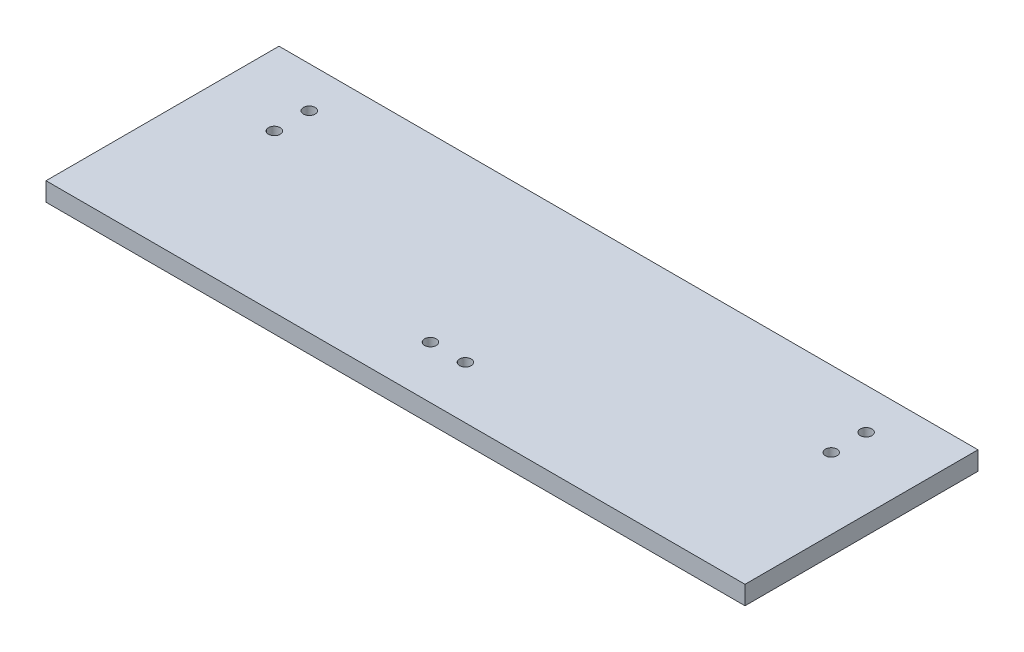
ISO-10303-21;
HEADER;
FILE_DESCRIPTION(('STEP AP214'),'2;1');
FILE_NAME('part.step','',(''),(''),'','','');
FILE_SCHEMA(('AUTOMOTIVE_DESIGN { 1 0 10303 214 1 1 1 1 }'));
ENDSEC;
DATA;
#1=APPLICATION_CONTEXT('core data for automotive mechanical design processes');
#2=APPLICATION_PROTOCOL_DEFINITION('international standard','automotive_design',2000,#1);
#3=PRODUCT_CONTEXT('',#1,'mechanical');
#4=PRODUCT('Part','Part','',(#3));
#5=PRODUCT_RELATED_PRODUCT_CATEGORY('part','',(#4));
#6=PRODUCT_DEFINITION_FORMATION('','',#4);
#7=PRODUCT_DEFINITION_CONTEXT('part definition',#1,'design');
#8=PRODUCT_DEFINITION('design','',#6,#7);
#9=PRODUCT_DEFINITION_SHAPE('','',#8);
#10=(LENGTH_UNIT() NAMED_UNIT(*) SI_UNIT(.MILLI.,.METRE.));
#11=(NAMED_UNIT(*) PLANE_ANGLE_UNIT() SI_UNIT($,.RADIAN.));
#12=(NAMED_UNIT(*) SI_UNIT($,.STERADIAN.) SOLID_ANGLE_UNIT());
#13=UNCERTAINTY_MEASURE_WITH_UNIT(LENGTH_MEASURE(1.E-05),#10,'distance_accuracy_value','');
#14=(GEOMETRIC_REPRESENTATION_CONTEXT(3) GLOBAL_UNCERTAINTY_ASSIGNED_CONTEXT((#13)) GLOBAL_UNIT_ASSIGNED_CONTEXT((#10,
#11,#12)) REPRESENTATION_CONTEXT('',''));
#15=CARTESIAN_POINT('',(0.,0.,0.));
#16=DIRECTION('',(0.,0.,1.));
#17=DIRECTION('',(1.,0.,0.));
#18=AXIS2_PLACEMENT_3D('',#15,#16,#17);
#19=CARTESIAN_POINT('',(-150.,8.,-50.));
#20=DIRECTION('',(1.,0.,0.));
#21=DIRECTION('',(0.,0.,-1.));
#22=AXIS2_PLACEMENT_3D('',#19,#20,#21);
#23=PLANE('',#22);
#24=DIRECTION('',(0.,0.,1.));
#25=VECTOR('',#24,1.);
#26=CARTESIAN_POINT('',(-150.,0.,-50.));
#27=LINE('',#26,#25);
#28=CARTESIAN_POINT('',(-150.,0.,-50.));
#29=VERTEX_POINT('',#28);
#30=CARTESIAN_POINT('',(-150.,0.,50.));
#31=VERTEX_POINT('',#30);
#32=EDGE_CURVE('E99',#29,#31,#27,.T.);
#33=ORIENTED_EDGE('',*,*,#32,.T.);
#34=DIRECTION('',(0.,-1.,0.));
#35=VECTOR('',#34,1.);
#36=CARTESIAN_POINT('',(-150.,8.,50.));
#37=LINE('',#36,#35);
#38=CARTESIAN_POINT('',(-150.,8.,50.));
#39=VERTEX_POINT('',#38);
#40=EDGE_CURVE('E11',#39,#31,#37,.T.);
#41=ORIENTED_EDGE('',*,*,#40,.F.);
#42=DIRECTION('',(0.,0.,1.));
#43=VECTOR('',#42,1.);
#44=CARTESIAN_POINT('',(-150.,8.,-50.));
#45=LINE('',#44,#43);
#46=CARTESIAN_POINT('',(-150.,8.,-50.));
#47=VERTEX_POINT('',#46);
#48=EDGE_CURVE('E87',#47,#39,#45,.T.);
#49=ORIENTED_EDGE('',*,*,#48,.F.);
#50=DIRECTION('',(0.,-1.,0.));
#51=VECTOR('',#50,1.);
#52=CARTESIAN_POINT('',(-150.,8.,-50.));
#53=LINE('',#52,#51);
#54=EDGE_CURVE('E95',#47,#29,#53,.T.);
#55=ORIENTED_EDGE('',*,*,#54,.T.);
#56=EDGE_LOOP('',(#33,#41,#49,#55));
#57=FACE_BOUND('',#56,.T.);
#58=ADVANCED_FACE('F36',(#57),#23,.F.);
#59=CARTESIAN_POINT('',(150.,8.,50.));
#60=DIRECTION('',(0.,0.,-1.));
#61=DIRECTION('',(-1.,0.,0.));
#62=AXIS2_PLACEMENT_3D('',#59,#60,#61);
#63=PLANE('',#62);
#64=DIRECTION('',(1.,0.,0.));
#65=VECTOR('',#64,1.);
#66=CARTESIAN_POINT('',(150.,0.,50.));
#67=LINE('',#66,#65);
#68=CARTESIAN_POINT('',(150.,0.,50.));
#69=VERTEX_POINT('',#68);
#70=EDGE_CURVE('E91',#31,#69,#67,.T.);
#71=ORIENTED_EDGE('',*,*,#70,.T.);
#72=DIRECTION('',(0.,-1.,0.));
#73=VECTOR('',#72,1.);
#74=CARTESIAN_POINT('',(150.,8.,50.));
#75=LINE('',#74,#73);
#76=CARTESIAN_POINT('',(150.,8.,50.));
#77=VERTEX_POINT('',#76);
#78=EDGE_CURVE('E44',#77,#69,#75,.T.);
#79=ORIENTED_EDGE('',*,*,#78,.F.);
#80=DIRECTION('',(1.,0.,0.));
#81=VECTOR('',#80,1.);
#82=CARTESIAN_POINT('',(150.,8.,50.));
#83=LINE('',#82,#81);
#84=EDGE_CURVE('E82',#39,#77,#83,.T.);
#85=ORIENTED_EDGE('',*,*,#84,.F.);
#86=ORIENTED_EDGE('',*,*,#40,.T.);
#87=EDGE_LOOP('',(#71,#79,#85,#86));
#88=FACE_BOUND('',#87,.T.);
#89=ADVANCED_FACE('F90',(#88),#63,.F.);
#90=CARTESIAN_POINT('',(150.,8.,-50.));
#91=DIRECTION('',(-1.,0.,0.));
#92=DIRECTION('',(0.,0.,1.));
#93=AXIS2_PLACEMENT_3D('',#90,#91,#92);
#94=PLANE('',#93);
#95=DIRECTION('',(0.,0.,-1.));
#96=VECTOR('',#95,1.);
#97=CARTESIAN_POINT('',(150.,0.,-50.));
#98=LINE('',#97,#96);
#99=CARTESIAN_POINT('',(150.,0.,-50.));
#100=VERTEX_POINT('',#99);
#101=EDGE_CURVE('E69',#69,#100,#98,.T.);
#102=ORIENTED_EDGE('',*,*,#101,.T.);
#103=DIRECTION('',(0.,-1.,0.));
#104=VECTOR('',#103,1.);
#105=CARTESIAN_POINT('',(150.,8.,-50.));
#106=LINE('',#105,#104);
#107=CARTESIAN_POINT('',(150.,8.,-50.));
#108=VERTEX_POINT('',#107);
#109=EDGE_CURVE('E92',#108,#100,#106,.T.);
#110=ORIENTED_EDGE('',*,*,#109,.F.);
#111=DIRECTION('',(0.,0.,-1.));
#112=VECTOR('',#111,1.);
#113=CARTESIAN_POINT('',(150.,8.,-50.));
#114=LINE('',#113,#112);
#115=EDGE_CURVE('E85',#77,#108,#114,.T.);
#116=ORIENTED_EDGE('',*,*,#115,.F.);
#117=ORIENTED_EDGE('',*,*,#78,.T.);
#118=EDGE_LOOP('',(#102,#110,#116,#117));
#119=FACE_BOUND('',#118,.T.);
#120=ADVANCED_FACE('F93',(#119),#94,.F.);
#121=CARTESIAN_POINT('',(150.,8.,-50.));
#122=DIRECTION('',(0.,0.,1.));
#123=DIRECTION('',(1.,0.,0.));
#124=AXIS2_PLACEMENT_3D('',#121,#122,#123);
#125=PLANE('',#124);
#126=DIRECTION('',(-1.,0.,0.));
#127=VECTOR('',#126,1.);
#128=CARTESIAN_POINT('',(150.,0.,-50.));
#129=LINE('',#128,#127);
#130=EDGE_CURVE('E75',#100,#29,#129,.T.);
#131=ORIENTED_EDGE('',*,*,#130,.T.);
#132=ORIENTED_EDGE('',*,*,#54,.F.);
#133=DIRECTION('',(-1.,0.,0.));
#134=VECTOR('',#133,1.);
#135=CARTESIAN_POINT('',(150.,8.,-50.));
#136=LINE('',#135,#134);
#137=EDGE_CURVE('E52',#108,#47,#136,.T.);
#138=ORIENTED_EDGE('',*,*,#137,.F.);
#139=ORIENTED_EDGE('',*,*,#109,.T.);
#140=EDGE_LOOP('',(#131,#132,#138,#139));
#141=FACE_BOUND('',#140,.T.);
#142=ADVANCED_FACE('F107',(#141),#125,.F.);
#143=CARTESIAN_POINT('',(0.,8.,0.));
#144=DIRECTION('',(0.,-1.,0.));
#145=DIRECTION('',(0.,0.,-1.));
#146=AXIS2_PLACEMENT_3D('',#143,#144,#145);
#147=PLANE('',#146);
#148=CARTESIAN_POINT('',(119.5,7.99999999999999,-17.5));
#149=DIRECTION('',(0.,-1.,0.));
#150=DIRECTION('',(0.,0.,1.));
#151=AXIS2_PLACEMENT_3D('',#148,#149,#150);
#152=CIRCLE('',#151,2.5);
#153=CARTESIAN_POINT('',(119.5,7.99999999999999,-15.));
#154=VERTEX_POINT('',#153);
#155=EDGE_CURVE('E143',#154,#154,#152,.T.);
#156=ORIENTED_EDGE('',*,*,#155,.T.);
#157=EDGE_LOOP('',(#156));
#158=FACE_BOUND('',#157,.T.);
#159=CARTESIAN_POINT('',(119.5,7.99999999999999,-32.5));
#160=DIRECTION('',(0.,-1.,0.));
#161=DIRECTION('',(0.,0.,1.));
#162=AXIS2_PLACEMENT_3D('',#159,#160,#161);
#163=CIRCLE('',#162,2.5);
#164=CARTESIAN_POINT('',(119.5,7.99999999999999,-30.));
#165=VERTEX_POINT('',#164);
#166=EDGE_CURVE('E137',#165,#165,#163,.T.);
#167=ORIENTED_EDGE('',*,*,#166,.T.);
#168=EDGE_LOOP('',(#167));
#169=FACE_BOUND('',#168,.T.);
#170=CARTESIAN_POINT('',(-119.5,7.99999999999999,-17.5));
#171=DIRECTION('',(0.,1.,0.));
#172=DIRECTION('',(0.,0.,1.));
#173=AXIS2_PLACEMENT_3D('',#170,#171,#172);
#174=CIRCLE('',#173,2.5);
#175=CARTESIAN_POINT('',(-119.5,7.99999999999999,-15.));
#176=VERTEX_POINT('',#175);
#177=EDGE_CURVE('E131',#176,#176,#174,.T.);
#178=ORIENTED_EDGE('',*,*,#177,.F.);
#179=EDGE_LOOP('',(#178));
#180=FACE_BOUND('',#179,.T.);
#181=CARTESIAN_POINT('',(-119.5,7.99999999999999,-32.5));
#182=DIRECTION('',(0.,1.,0.));
#183=DIRECTION('',(0.,0.,1.));
#184=AXIS2_PLACEMENT_3D('',#181,#182,#183);
#185=CIRCLE('',#184,2.5);
#186=CARTESIAN_POINT('',(-119.5,7.99999999999999,-30.));
#187=VERTEX_POINT('',#186);
#188=EDGE_CURVE('E125',#187,#187,#185,.T.);
#189=ORIENTED_EDGE('',*,*,#188,.F.);
#190=EDGE_LOOP('',(#189));
#191=FACE_BOUND('',#190,.T.);
#192=CARTESIAN_POINT('',(7.50000000000083,7.99999999999999,27.5));
#193=DIRECTION('',(0.,1.,0.));
#194=DIRECTION('',(0.,0.,1.));
#195=AXIS2_PLACEMENT_3D('',#192,#193,#194);
#196=CIRCLE('',#195,2.5);
#197=CARTESIAN_POINT('',(7.50000000000083,7.99999999999999,30.));
#198=VERTEX_POINT('',#197);
#199=EDGE_CURVE('E119',#198,#198,#196,.T.);
#200=ORIENTED_EDGE('',*,*,#199,.F.);
#201=EDGE_LOOP('',(#200));
#202=FACE_BOUND('',#201,.T.);
#203=CARTESIAN_POINT('',(-7.49999999999917,7.99999999999999,27.5));
#204=DIRECTION('',(0.,1.,0.));
#205=DIRECTION('',(0.,0.,1.));
#206=AXIS2_PLACEMENT_3D('',#203,#204,#205);
#207=CIRCLE('',#206,2.50000000000001);
#208=CARTESIAN_POINT('',(-7.49999999999917,7.99999999999999,30.));
#209=VERTEX_POINT('',#208);
#210=EDGE_CURVE('E113',#209,#209,#207,.T.);
#211=ORIENTED_EDGE('',*,*,#210,.F.);
#212=EDGE_LOOP('',(#211));
#213=FACE_BOUND('',#212,.T.);
#214=ORIENTED_EDGE('',*,*,#48,.T.);
#215=ORIENTED_EDGE('',*,*,#84,.T.);
#216=ORIENTED_EDGE('',*,*,#115,.T.);
#217=ORIENTED_EDGE('',*,*,#137,.T.);
#218=EDGE_LOOP('',(#214,#215,#216,#217));
#219=FACE_BOUND('',#218,.T.);
#220=ADVANCED_FACE('F83',(#158,#169,#180,#191,#202,#213,#219),#147,.F.);
#221=CARTESIAN_POINT('',(0.,0.,0.));
#222=DIRECTION('',(0.,-1.,0.));
#223=DIRECTION('',(0.,0.,-1.));
#224=AXIS2_PLACEMENT_3D('',#221,#222,#223);
#225=PLANE('',#224);
#226=CARTESIAN_POINT('',(119.5,0.,-17.5));
#227=DIRECTION('',(0.,-1.,0.));
#228=DIRECTION('',(0.,0.,1.));
#229=AXIS2_PLACEMENT_3D('',#226,#227,#228);
#230=CIRCLE('',#229,2.5);
#231=CARTESIAN_POINT('',(119.5,0.,-15.));
#232=VERTEX_POINT('',#231);
#233=EDGE_CURVE('E140',#232,#232,#230,.T.);
#234=ORIENTED_EDGE('',*,*,#233,.F.);
#235=EDGE_LOOP('',(#234));
#236=FACE_BOUND('',#235,.T.);
#237=CARTESIAN_POINT('',(119.5,0.,-32.5));
#238=DIRECTION('',(0.,-1.,0.));
#239=DIRECTION('',(0.,0.,1.));
#240=AXIS2_PLACEMENT_3D('',#237,#238,#239);
#241=CIRCLE('',#240,2.5);
#242=CARTESIAN_POINT('',(119.5,0.,-30.));
#243=VERTEX_POINT('',#242);
#244=EDGE_CURVE('E134',#243,#243,#241,.T.);
#245=ORIENTED_EDGE('',*,*,#244,.F.);
#246=EDGE_LOOP('',(#245));
#247=FACE_BOUND('',#246,.T.);
#248=CARTESIAN_POINT('',(-119.5,0.,-17.5));
#249=DIRECTION('',(0.,1.,0.));
#250=DIRECTION('',(0.,0.,1.));
#251=AXIS2_PLACEMENT_3D('',#248,#249,#250);
#252=CIRCLE('',#251,2.5);
#253=CARTESIAN_POINT('',(-119.5,0.,-15.));
#254=VERTEX_POINT('',#253);
#255=EDGE_CURVE('E128',#254,#254,#252,.T.);
#256=ORIENTED_EDGE('',*,*,#255,.T.);
#257=EDGE_LOOP('',(#256));
#258=FACE_BOUND('',#257,.T.);
#259=CARTESIAN_POINT('',(-119.5,0.,-32.5));
#260=DIRECTION('',(0.,1.,0.));
#261=DIRECTION('',(0.,0.,1.));
#262=AXIS2_PLACEMENT_3D('',#259,#260,#261);
#263=CIRCLE('',#262,2.5);
#264=CARTESIAN_POINT('',(-119.5,0.,-30.));
#265=VERTEX_POINT('',#264);
#266=EDGE_CURVE('E122',#265,#265,#263,.T.);
#267=ORIENTED_EDGE('',*,*,#266,.T.);
#268=EDGE_LOOP('',(#267));
#269=FACE_BOUND('',#268,.T.);
#270=CARTESIAN_POINT('',(7.50000000000083,0.,27.5));
#271=DIRECTION('',(0.,1.,0.));
#272=DIRECTION('',(0.,0.,1.));
#273=AXIS2_PLACEMENT_3D('',#270,#271,#272);
#274=CIRCLE('',#273,2.5);
#275=CARTESIAN_POINT('',(7.50000000000083,0.,30.));
#276=VERTEX_POINT('',#275);
#277=EDGE_CURVE('E116',#276,#276,#274,.T.);
#278=ORIENTED_EDGE('',*,*,#277,.T.);
#279=EDGE_LOOP('',(#278));
#280=FACE_BOUND('',#279,.T.);
#281=CARTESIAN_POINT('',(-7.49999999999917,0.,27.5));
#282=DIRECTION('',(0.,1.,0.));
#283=DIRECTION('',(0.,0.,1.));
#284=AXIS2_PLACEMENT_3D('',#281,#282,#283);
#285=CIRCLE('',#284,2.50000000000001);
#286=CARTESIAN_POINT('',(-7.49999999999917,0.,30.));
#287=VERTEX_POINT('',#286);
#288=EDGE_CURVE('E102',#287,#287,#285,.T.);
#289=ORIENTED_EDGE('',*,*,#288,.T.);
#290=EDGE_LOOP('',(#289));
#291=FACE_BOUND('',#290,.T.);
#292=ORIENTED_EDGE('',*,*,#32,.F.);
#293=ORIENTED_EDGE('',*,*,#130,.F.);
#294=ORIENTED_EDGE('',*,*,#101,.F.);
#295=ORIENTED_EDGE('',*,*,#70,.F.);
#296=EDGE_LOOP('',(#292,#293,#294,#295));
#297=FACE_BOUND('',#296,.T.);
#298=ADVANCED_FACE('F110',(#236,#247,#258,#269,#280,#291,#297),#225,.T.);
#299=CARTESIAN_POINT('',(-7.49999999999917,0.,27.5));
#300=DIRECTION('',(0.,1.,0.));
#301=DIRECTION('',(0.,0.,1.));
#302=AXIS2_PLACEMENT_3D('',#299,#300,#301);
#303=CYLINDRICAL_SURFACE('',#302,2.50000000000001);
#304=ORIENTED_EDGE('',*,*,#288,.F.);
#305=EDGE_LOOP('',(#304));
#306=FACE_BOUND('',#305,.T.);
#307=ORIENTED_EDGE('',*,*,#210,.T.);
#308=EDGE_LOOP('',(#307));
#309=FACE_BOUND('',#308,.T.);
#310=ADVANCED_FACE('F154',(#306,#309),#303,.F.);
#311=CARTESIAN_POINT('',(7.50000000000083,0.,27.5));
#312=DIRECTION('',(0.,1.,0.));
#313=DIRECTION('',(0.,0.,1.));
#314=AXIS2_PLACEMENT_3D('',#311,#312,#313);
#315=CYLINDRICAL_SURFACE('',#314,2.5);
#316=ORIENTED_EDGE('',*,*,#277,.F.);
#317=EDGE_LOOP('',(#316));
#318=FACE_BOUND('',#317,.T.);
#319=ORIENTED_EDGE('',*,*,#199,.T.);
#320=EDGE_LOOP('',(#319));
#321=FACE_BOUND('',#320,.T.);
#322=ADVANCED_FACE('F168',(#318,#321),#315,.F.);
#323=CARTESIAN_POINT('',(-119.5,0.,-32.5));
#324=DIRECTION('',(0.,1.,0.));
#325=DIRECTION('',(0.,0.,1.));
#326=AXIS2_PLACEMENT_3D('',#323,#324,#325);
#327=CYLINDRICAL_SURFACE('',#326,2.5);
#328=ORIENTED_EDGE('',*,*,#266,.F.);
#329=EDGE_LOOP('',(#328));
#330=FACE_BOUND('',#329,.T.);
#331=ORIENTED_EDGE('',*,*,#188,.T.);
#332=EDGE_LOOP('',(#331));
#333=FACE_BOUND('',#332,.T.);
#334=ADVANCED_FACE('F216',(#330,#333),#327,.F.);
#335=CARTESIAN_POINT('',(-119.5,0.,-17.5));
#336=DIRECTION('',(0.,1.,0.));
#337=DIRECTION('',(0.,0.,1.));
#338=AXIS2_PLACEMENT_3D('',#335,#336,#337);
#339=CYLINDRICAL_SURFACE('',#338,2.5);
#340=ORIENTED_EDGE('',*,*,#255,.F.);
#341=EDGE_LOOP('',(#340));
#342=FACE_BOUND('',#341,.T.);
#343=ORIENTED_EDGE('',*,*,#177,.T.);
#344=EDGE_LOOP('',(#343));
#345=FACE_BOUND('',#344,.T.);
#346=ADVANCED_FACE('F224',(#342,#345),#339,.F.);
#347=CARTESIAN_POINT('',(119.5,0.,-32.5));
#348=DIRECTION('',(0.,1.,0.));
#349=DIRECTION('',(0.,0.,1.));
#350=AXIS2_PLACEMENT_3D('',#347,#348,#349);
#351=CYLINDRICAL_SURFACE('',#350,2.5);
#352=ORIENTED_EDGE('',*,*,#244,.T.);
#353=EDGE_LOOP('',(#352));
#354=FACE_BOUND('',#353,.T.);
#355=ORIENTED_EDGE('',*,*,#166,.F.);
#356=EDGE_LOOP('',(#355));
#357=FACE_BOUND('',#356,.T.);
#358=ADVANCED_FACE('F231',(#354,#357),#351,.F.);
#359=CARTESIAN_POINT('',(119.5,0.,-17.5));
#360=DIRECTION('',(0.,1.,0.));
#361=DIRECTION('',(0.,0.,1.));
#362=AXIS2_PLACEMENT_3D('',#359,#360,#361);
#363=CYLINDRICAL_SURFACE('',#362,2.5);
#364=ORIENTED_EDGE('',*,*,#233,.T.);
#365=EDGE_LOOP('',(#364));
#366=FACE_BOUND('',#365,.T.);
#367=ORIENTED_EDGE('',*,*,#155,.F.);
#368=EDGE_LOOP('',(#367));
#369=FACE_BOUND('',#368,.T.);
#370=ADVANCED_FACE('F149',(#366,#369),#363,.F.);
#371=CLOSED_SHELL('',(#58,#89,#120,#142,#220,#298,#310,#322,#334,#346,#358,#370));
#372=MANIFOLD_SOLID_BREP('B2',#371);
#373=ADVANCED_BREP_SHAPE_REPRESENTATION('',(#18,#372),#14);
#374=SHAPE_DEFINITION_REPRESENTATION(#9,#373);
ENDSEC;
END-ISO-10303-21;
